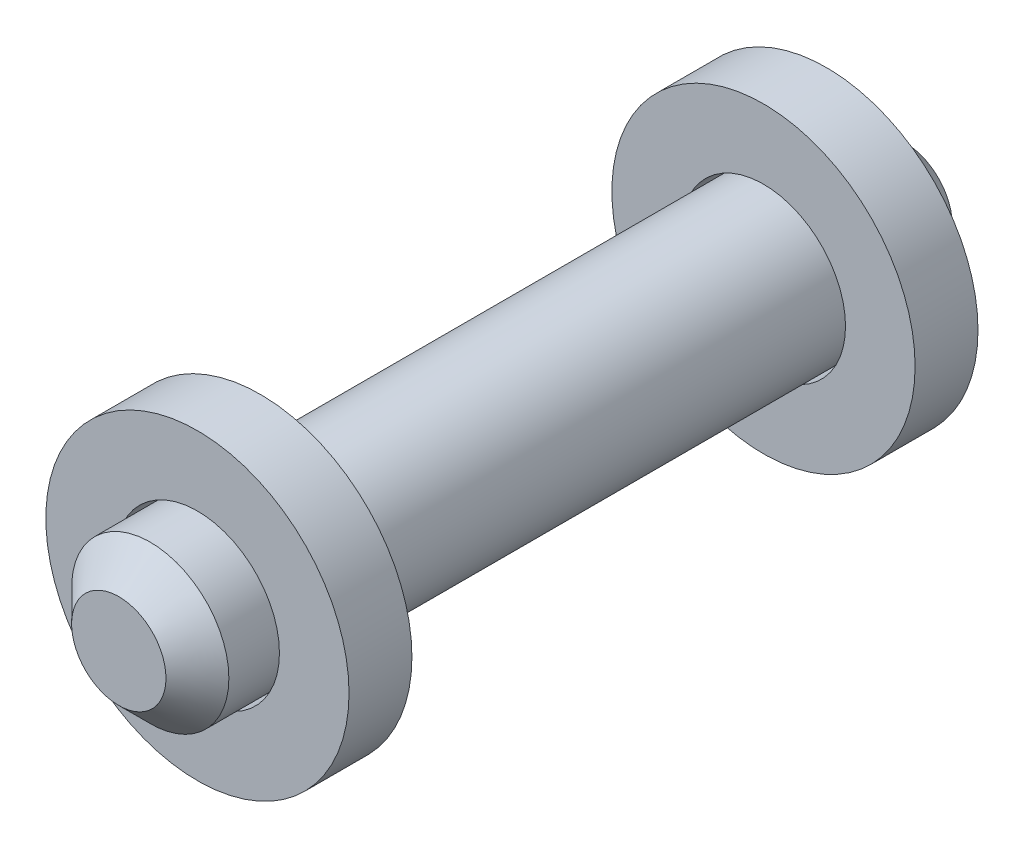
ISO-10303-21;
HEADER;
FILE_DESCRIPTION(('STEP AP214'),'2;1');
FILE_NAME('part.step','',(''),(''),'','','');
FILE_SCHEMA(('AUTOMOTIVE_DESIGN { 1 0 10303 214 1 1 1 1 }'));
ENDSEC;
DATA;
#1=APPLICATION_CONTEXT('core data for automotive mechanical design processes');
#2=APPLICATION_PROTOCOL_DEFINITION('international standard','automotive_design',2000,#1);
#3=PRODUCT_CONTEXT('',#1,'mechanical');
#4=PRODUCT('Part','Part','',(#3));
#5=PRODUCT_RELATED_PRODUCT_CATEGORY('part','',(#4));
#6=PRODUCT_DEFINITION_FORMATION('','',#4);
#7=PRODUCT_DEFINITION_CONTEXT('part definition',#1,'design');
#8=PRODUCT_DEFINITION('design','',#6,#7);
#9=PRODUCT_DEFINITION_SHAPE('','',#8);
#10=(LENGTH_UNIT() NAMED_UNIT(*) SI_UNIT(.MILLI.,.METRE.));
#11=(NAMED_UNIT(*) PLANE_ANGLE_UNIT() SI_UNIT($,.RADIAN.));
#12=(NAMED_UNIT(*) SI_UNIT($,.STERADIAN.) SOLID_ANGLE_UNIT());
#13=UNCERTAINTY_MEASURE_WITH_UNIT(LENGTH_MEASURE(1.E-05),#10,'distance_accuracy_value','');
#14=(GEOMETRIC_REPRESENTATION_CONTEXT(3) GLOBAL_UNCERTAINTY_ASSIGNED_CONTEXT((#13)) GLOBAL_UNIT_ASSIGNED_CONTEXT((#10,
#11,#12)) REPRESENTATION_CONTEXT('',''));
#15=CARTESIAN_POINT('',(0.,0.,0.));
#16=DIRECTION('',(0.,0.,1.));
#17=DIRECTION('',(1.,0.,0.));
#18=AXIS2_PLACEMENT_3D('',#15,#16,#17);
#19=CARTESIAN_POINT('',(0.,0.,-10.));
#20=DIRECTION('',(0.,0.,-1.));
#21=DIRECTION('',(1.,0.,0.));
#22=AXIS2_PLACEMENT_3D('',#19,#20,#21);
#23=PLANE('',#22);
#24=CARTESIAN_POINT('',(0.,0.,-10.));
#25=DIRECTION('',(0.,0.,1.));
#26=DIRECTION('',(1.,0.,0.));
#27=AXIS2_PLACEMENT_3D('',#24,#25,#26);
#28=CIRCLE('',#27,4.82079346270476);
#29=CARTESIAN_POINT('',(4.82079346270476,0.,-10.));
#30=VERTEX_POINT('',#29);
#31=EDGE_CURVE('E11',#30,#30,#28,.T.);
#32=ORIENTED_EDGE('',*,*,#31,.F.);
#33=EDGE_LOOP('',(#32));
#34=FACE_BOUND('',#33,.T.);
#35=CARTESIAN_POINT('',(0.,0.,-10.));
#36=DIRECTION('',(0.,0.,1.));
#37=DIRECTION('',(1.,0.,0.));
#38=AXIS2_PLACEMENT_3D('',#35,#36,#37);
#39=CIRCLE('',#38,2.60774436707483);
#40=CARTESIAN_POINT('',(2.60774436707483,0.,-10.));
#41=VERTEX_POINT('',#40);
#42=EDGE_CURVE('E61',#41,#41,#39,.T.);
#43=ORIENTED_EDGE('',*,*,#42,.T.);
#44=EDGE_LOOP('',(#43));
#45=FACE_BOUND('',#44,.T.);
#46=ADVANCED_FACE('F50',(#34,#45),#23,.T.);
#47=CARTESIAN_POINT('',(0.,0.,-8.));
#48=DIRECTION('',(0.,0.,-1.));
#49=DIRECTION('',(1.,0.,0.));
#50=AXIS2_PLACEMENT_3D('',#47,#48,#49);
#51=PLANE('',#50);
#52=CARTESIAN_POINT('',(0.,0.,-8.));
#53=DIRECTION('',(0.,0.,1.));
#54=DIRECTION('',(1.,0.,0.));
#55=AXIS2_PLACEMENT_3D('',#52,#53,#54);
#56=CIRCLE('',#55,4.82079346270476);
#57=CARTESIAN_POINT('',(4.82079346270476,0.,-8.));
#58=VERTEX_POINT('',#57);
#59=EDGE_CURVE('E54',#58,#58,#56,.T.);
#60=ORIENTED_EDGE('',*,*,#59,.T.);
#61=EDGE_LOOP('',(#60));
#62=FACE_BOUND('',#61,.T.);
#63=CARTESIAN_POINT('',(0.,0.,-8.));
#64=DIRECTION('',(0.,0.,1.));
#65=DIRECTION('',(1.,0.,0.));
#66=AXIS2_PLACEMENT_3D('',#63,#64,#65);
#67=CIRCLE('',#66,2.60774436707483);
#68=CARTESIAN_POINT('',(2.60774436707483,0.,-8.));
#69=VERTEX_POINT('',#68);
#70=EDGE_CURVE('E63',#69,#69,#67,.T.);
#71=ORIENTED_EDGE('',*,*,#70,.F.);
#72=EDGE_LOOP('',(#71));
#73=FACE_BOUND('',#72,.T.);
#74=ADVANCED_FACE('F76',(#62,#73),#51,.F.);
#75=CARTESIAN_POINT('',(0.,0.,-10.));
#76=DIRECTION('',(0.,0.,1.));
#77=DIRECTION('',(-1.,0.,0.));
#78=AXIS2_PLACEMENT_3D('',#75,#76,#77);
#79=CYLINDRICAL_SURFACE('',#78,4.82079346270476);
#80=ORIENTED_EDGE('',*,*,#31,.T.);
#81=EDGE_LOOP('',(#80));
#82=FACE_BOUND('',#81,.T.);
#83=ORIENTED_EDGE('',*,*,#59,.F.);
#84=EDGE_LOOP('',(#83));
#85=FACE_BOUND('',#84,.T.);
#86=ADVANCED_FACE('F52',(#82,#85),#79,.T.);
#87=CARTESIAN_POINT('',(0.,0.,-10.));
#88=DIRECTION('',(0.,0.,1.));
#89=DIRECTION('',(-1.,0.,0.));
#90=AXIS2_PLACEMENT_3D('',#87,#88,#89);
#91=CYLINDRICAL_SURFACE('',#90,2.60774436707483);
#92=ORIENTED_EDGE('',*,*,#42,.F.);
#93=EDGE_LOOP('',(#92));
#94=FACE_BOUND('',#93,.T.);
#95=ORIENTED_EDGE('',*,*,#70,.T.);
#96=EDGE_LOOP('',(#95));
#97=FACE_BOUND('',#96,.T.);
#98=ADVANCED_FACE('F70',(#94,#97),#91,.F.);
#99=CLOSED_SHELL('',(#46,#74,#86,#98));
#100=MANIFOLD_SOLID_BREP('B2',#99);
#101=CARTESIAN_POINT('',(0.,0.,10.));
#102=DIRECTION('',(0.,0.,1.));
#103=DIRECTION('',(1.,0.,0.));
#104=AXIS2_PLACEMENT_3D('',#101,#102,#103);
#105=PLANE('',#104);
#106=CARTESIAN_POINT('',(0.,0.,10.));
#107=DIRECTION('',(0.,0.,1.));
#108=DIRECTION('',(1.,0.,0.));
#109=AXIS2_PLACEMENT_3D('',#106,#107,#108);
#110=CIRCLE('',#109,4.82079346270476);
#111=CARTESIAN_POINT('',(4.82079346270476,0.,10.));
#112=VERTEX_POINT('',#111);
#113=EDGE_CURVE('E49',#112,#112,#110,.T.);
#114=ORIENTED_EDGE('',*,*,#113,.T.);
#115=EDGE_LOOP('',(#114));
#116=FACE_BOUND('',#115,.T.);
#117=CARTESIAN_POINT('',(0.,0.,10.));
#118=DIRECTION('',(0.,0.,1.));
#119=DIRECTION('',(1.,0.,0.));
#120=AXIS2_PLACEMENT_3D('',#117,#118,#119);
#121=CIRCLE('',#120,2.60774436707483);
#122=CARTESIAN_POINT('',(2.60774436707483,0.,10.));
#123=VERTEX_POINT('',#122);
#124=EDGE_CURVE('E146',#123,#123,#121,.T.);
#125=ORIENTED_EDGE('',*,*,#124,.F.);
#126=EDGE_LOOP('',(#125));
#127=FACE_BOUND('',#126,.T.);
#128=ADVANCED_FACE('F135',(#116,#127),#105,.T.);
#129=CARTESIAN_POINT('',(0.,0.,8.));
#130=DIRECTION('',(0.,0.,1.));
#131=DIRECTION('',(1.,0.,0.));
#132=AXIS2_PLACEMENT_3D('',#129,#130,#131);
#133=PLANE('',#132);
#134=CARTESIAN_POINT('',(0.,0.,8.));
#135=DIRECTION('',(0.,0.,1.));
#136=DIRECTION('',(1.,0.,0.));
#137=AXIS2_PLACEMENT_3D('',#134,#135,#136);
#138=CIRCLE('',#137,4.82079346270476);
#139=CARTESIAN_POINT('',(4.82079346270476,0.,8.));
#140=VERTEX_POINT('',#139);
#141=EDGE_CURVE('E139',#140,#140,#138,.T.);
#142=ORIENTED_EDGE('',*,*,#141,.F.);
#143=EDGE_LOOP('',(#142));
#144=FACE_BOUND('',#143,.T.);
#145=CARTESIAN_POINT('',(0.,0.,8.));
#146=DIRECTION('',(0.,0.,1.));
#147=DIRECTION('',(1.,0.,0.));
#148=AXIS2_PLACEMENT_3D('',#145,#146,#147);
#149=CIRCLE('',#148,2.60774436707483);
#150=CARTESIAN_POINT('',(2.60774436707483,0.,8.));
#151=VERTEX_POINT('',#150);
#152=EDGE_CURVE('E148',#151,#151,#149,.T.);
#153=ORIENTED_EDGE('',*,*,#152,.T.);
#154=EDGE_LOOP('',(#153));
#155=FACE_BOUND('',#154,.T.);
#156=ADVANCED_FACE('F158',(#144,#155),#133,.F.);
#157=CARTESIAN_POINT('',(0.,0.,10.));
#158=DIRECTION('',(0.,0.,-1.));
#159=DIRECTION('',(-1.,0.,0.));
#160=AXIS2_PLACEMENT_3D('',#157,#158,#159);
#161=CYLINDRICAL_SURFACE('',#160,4.82079346270476);
#162=ORIENTED_EDGE('',*,*,#113,.F.);
#163=EDGE_LOOP('',(#162));
#164=FACE_BOUND('',#163,.T.);
#165=ORIENTED_EDGE('',*,*,#141,.T.);
#166=EDGE_LOOP('',(#165));
#167=FACE_BOUND('',#166,.T.);
#168=ADVANCED_FACE('F137',(#164,#167),#161,.T.);
#169=CARTESIAN_POINT('',(0.,0.,10.));
#170=DIRECTION('',(0.,0.,-1.));
#171=DIRECTION('',(-1.,0.,0.));
#172=AXIS2_PLACEMENT_3D('',#169,#170,#171);
#173=CYLINDRICAL_SURFACE('',#172,2.60774436707483);
#174=ORIENTED_EDGE('',*,*,#124,.T.);
#175=EDGE_LOOP('',(#174));
#176=FACE_BOUND('',#175,.T.);
#177=ORIENTED_EDGE('',*,*,#152,.F.);
#178=EDGE_LOOP('',(#177));
#179=FACE_BOUND('',#178,.T.);
#180=ADVANCED_FACE('F154',(#176,#179),#173,.F.);
#181=CLOSED_SHELL('',(#128,#156,#168,#180));
#182=MANIFOLD_SOLID_BREP('B6',#181);
#183=CARTESIAN_POINT('',(0.,0.,12.5));
#184=DIRECTION('',(0.,0.,-1.));
#185=DIRECTION('',(-1.,0.,0.));
#186=AXIS2_PLACEMENT_3D('',#183,#184,#185);
#187=CYLINDRICAL_SURFACE('',#186,2.5);
#188=CARTESIAN_POINT('',(0.,0.,-11.5));
#189=DIRECTION('',(0.,0.,1.));
#190=DIRECTION('',(1.,0.,0.));
#191=AXIS2_PLACEMENT_3D('',#188,#189,#190);
#192=CIRCLE('',#191,2.5);
#193=CARTESIAN_POINT('',(2.5,0.,-11.5));
#194=VERTEX_POINT('',#193);
#195=EDGE_CURVE('E200',#194,#194,#192,.T.);
#196=ORIENTED_EDGE('',*,*,#195,.T.);
#197=EDGE_LOOP('',(#196));
#198=FACE_BOUND('',#197,.T.);
#199=CARTESIAN_POINT('',(0.,0.,11.5));
#200=DIRECTION('',(0.,0.,1.));
#201=DIRECTION('',(1.,0.,0.));
#202=AXIS2_PLACEMENT_3D('',#199,#200,#201);
#203=CIRCLE('',#202,2.5);
#204=CARTESIAN_POINT('',(2.5,0.,11.5));
#205=VERTEX_POINT('',#204);
#206=EDGE_CURVE('E204',#205,#205,#203,.F.);
#207=ORIENTED_EDGE('',*,*,#206,.T.);
#208=EDGE_LOOP('',(#207));
#209=FACE_BOUND('',#208,.T.);
#210=ADVANCED_FACE('F189',(#198,#209),#187,.T.);
#211=CARTESIAN_POINT('',(0.,0.,12.5));
#212=DIRECTION('',(0.,0.,1.));
#213=DIRECTION('',(1.,0.,0.));
#214=AXIS2_PLACEMENT_3D('',#211,#212,#213);
#215=PLANE('',#214);
#216=CARTESIAN_POINT('',(0.,0.,12.5));
#217=DIRECTION('',(0.,0.,1.));
#218=DIRECTION('',(1.,0.,0.));
#219=AXIS2_PLACEMENT_3D('',#216,#217,#218);
#220=CIRCLE('',#219,1.5);
#221=CARTESIAN_POINT('',(1.5,0.,12.5));
#222=VERTEX_POINT('',#221);
#223=EDGE_CURVE('E134',#222,#222,#220,.T.);
#224=ORIENTED_EDGE('',*,*,#223,.T.);
#225=EDGE_LOOP('',(#224));
#226=FACE_BOUND('',#225,.T.);
#227=ADVANCED_FACE('F220',(#226),#215,.T.);
#228=CARTESIAN_POINT('',(0.,0.,-12.5));
#229=DIRECTION('',(0.,0.,1.));
#230=DIRECTION('',(1.,0.,0.));
#231=AXIS2_PLACEMENT_3D('',#228,#229,#230);
#232=PLANE('',#231);
#233=CARTESIAN_POINT('',(0.,0.,-12.5));
#234=DIRECTION('',(0.,0.,1.));
#235=DIRECTION('',(1.,0.,0.));
#236=AXIS2_PLACEMENT_3D('',#233,#234,#235);
#237=CIRCLE('',#236,1.49999999999999);
#238=CARTESIAN_POINT('',(1.49999999999999,0.,-12.5));
#239=VERTEX_POINT('',#238);
#240=EDGE_CURVE('E196',#239,#239,#237,.F.);
#241=ORIENTED_EDGE('',*,*,#240,.T.);
#242=EDGE_LOOP('',(#241));
#243=FACE_BOUND('',#242,.T.);
#244=ADVANCED_FACE('F217',(#243),#232,.F.);
#245=CARTESIAN_POINT('',(0.,0.,-11.5));
#246=DIRECTION('',(0.,0.,1.));
#247=DIRECTION('',(1.,0.,0.));
#248=AXIS2_PLACEMENT_3D('',#245,#246,#247);
#249=CONICAL_SURFACE('',#248,2.5,0.785398163397449);
#250=ORIENTED_EDGE('',*,*,#240,.F.);
#251=EDGE_LOOP('',(#250));
#252=FACE_BOUND('',#251,.T.);
#253=ORIENTED_EDGE('',*,*,#195,.F.);
#254=EDGE_LOOP('',(#253));
#255=FACE_BOUND('',#254,.T.);
#256=ADVANCED_FACE('F213',(#252,#255),#249,.T.);
#257=CARTESIAN_POINT('',(0.,0.,12.5));
#258=DIRECTION('',(0.,0.,-1.));
#259=DIRECTION('',(-1.,0.,0.));
#260=AXIS2_PLACEMENT_3D('',#257,#258,#259);
#261=CONICAL_SURFACE('',#260,1.5,0.785398163397445);
#262=ORIENTED_EDGE('',*,*,#206,.F.);
#263=EDGE_LOOP('',(#262));
#264=FACE_BOUND('',#263,.T.);
#265=ORIENTED_EDGE('',*,*,#223,.F.);
#266=EDGE_LOOP('',(#265));
#267=FACE_BOUND('',#266,.T.);
#268=ADVANCED_FACE('F191',(#264,#267),#261,.T.);
#269=CLOSED_SHELL('',(#210,#227,#244,#256,#268));
#270=MANIFOLD_SOLID_BREP('B44',#269);
#271=ADVANCED_BREP_SHAPE_REPRESENTATION('',(#18,#100,#182,#270),#14);
#272=SHAPE_DEFINITION_REPRESENTATION(#9,#271);
ENDSEC;
END-ISO-10303-21;
